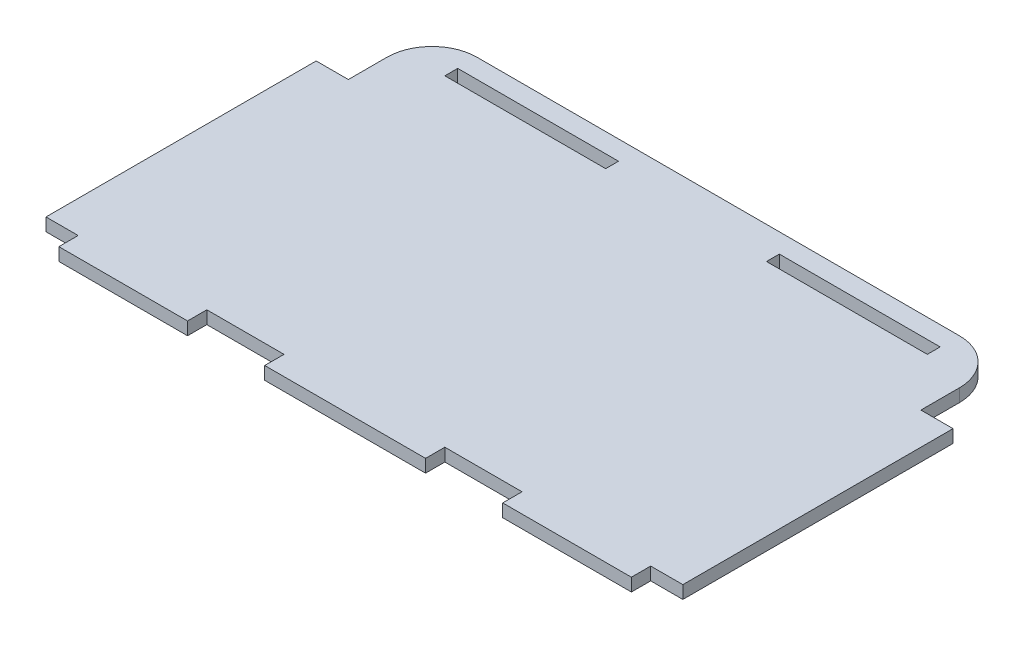
ISO-10303-21;
HEADER;
FILE_DESCRIPTION(('STEP AP214'),'2;1');
FILE_NAME('part.step','',(''),(''),'','','');
FILE_SCHEMA(('AUTOMOTIVE_DESIGN { 1 0 10303 214 1 1 1 1 }'));
ENDSEC;
DATA;
#1=APPLICATION_CONTEXT('core data for automotive mechanical design processes');
#2=APPLICATION_PROTOCOL_DEFINITION('international standard','automotive_design',2000,#1);
#3=PRODUCT_CONTEXT('',#1,'mechanical');
#4=PRODUCT('Part','Part','',(#3));
#5=PRODUCT_RELATED_PRODUCT_CATEGORY('part','',(#4));
#6=PRODUCT_DEFINITION_FORMATION('','',#4);
#7=PRODUCT_DEFINITION_CONTEXT('part definition',#1,'design');
#8=PRODUCT_DEFINITION('design','',#6,#7);
#9=PRODUCT_DEFINITION_SHAPE('','',#8);
#10=(LENGTH_UNIT() NAMED_UNIT(*) SI_UNIT(.MILLI.,.METRE.));
#11=(NAMED_UNIT(*) PLANE_ANGLE_UNIT() SI_UNIT($,.RADIAN.));
#12=(NAMED_UNIT(*) SI_UNIT($,.STERADIAN.) SOLID_ANGLE_UNIT());
#13=UNCERTAINTY_MEASURE_WITH_UNIT(LENGTH_MEASURE(1.E-05),#10,'distance_accuracy_value','');
#14=(GEOMETRIC_REPRESENTATION_CONTEXT(3) GLOBAL_UNCERTAINTY_ASSIGNED_CONTEXT((#13)) GLOBAL_UNIT_ASSIGNED_CONTEXT((#10,
#11,#12)) REPRESENTATION_CONTEXT('',''));
#15=CARTESIAN_POINT('',(0.,0.,0.));
#16=DIRECTION('',(0.,0.,1.));
#17=DIRECTION('',(1.,0.,0.));
#18=AXIS2_PLACEMENT_3D('',#15,#16,#17);
#19=CARTESIAN_POINT('',(-44.5,-23.5,134.022469073824));
#20=DIRECTION('',(1.,0.,0.));
#21=DIRECTION('',(0.,0.,-1.));
#22=AXIS2_PLACEMENT_3D('',#19,#20,#21);
#23=PLANE('',#22);
#24=DIRECTION('',(0.,0.,-1.));
#25=VECTOR('',#24,1.);
#26=CARTESIAN_POINT('',(-44.5,-21.5,134.022469073824));
#27=LINE('',#26,#25);
#28=CARTESIAN_POINT('',(-44.4999999999999,-21.5,0.));
#29=VERTEX_POINT('',#28);
#30=CARTESIAN_POINT('',(-44.5,-21.5,-6.00000000000001));
#31=VERTEX_POINT('',#30);
#32=EDGE_CURVE('E369',#29,#31,#27,.T.);
#33=ORIENTED_EDGE('',*,*,#32,.T.);
#34=DIRECTION('',(0.,1.,0.));
#35=VECTOR('',#34,1.);
#36=CARTESIAN_POINT('',(-44.5,-23.5,-6.00000000000001));
#37=LINE('',#36,#35);
#38=CARTESIAN_POINT('',(-44.5,-23.5,-6.00000000000001));
#39=VERTEX_POINT('',#38);
#40=EDGE_CURVE('E56',#31,#39,#37,.F.);
#41=ORIENTED_EDGE('',*,*,#40,.T.);
#42=DIRECTION('',(0.,0.,-1.));
#43=VECTOR('',#42,1.);
#44=CARTESIAN_POINT('',(-44.5,-23.5,134.022469073824));
#45=LINE('',#44,#43);
#46=CARTESIAN_POINT('',(-44.4999999999999,-23.5,0.));
#47=VERTEX_POINT('',#46);
#48=EDGE_CURVE('E359',#47,#39,#45,.T.);
#49=ORIENTED_EDGE('',*,*,#48,.F.);
#50=DIRECTION('',(0.,1.,0.));
#51=VECTOR('',#50,1.);
#52=CARTESIAN_POINT('',(-44.4999999999999,-21.5,0.));
#53=LINE('',#52,#51);
#54=EDGE_CURVE('E293',#47,#29,#53,.T.);
#55=ORIENTED_EDGE('',*,*,#54,.T.);
#56=EDGE_LOOP('',(#33,#41,#49,#55));
#57=FACE_BOUND('',#56,.T.);
#58=ADVANCED_FACE('F33',(#57),#23,.F.);
#59=CARTESIAN_POINT('',(44.5,-23.5,134.022469073824));
#60=DIRECTION('',(-1.,0.,0.));
#61=DIRECTION('',(0.,-1.,0.));
#62=AXIS2_PLACEMENT_3D('',#59,#60,#61);
#63=PLANE('',#62);
#64=DIRECTION('',(0.,0.,-1.));
#65=VECTOR('',#64,1.);
#66=CARTESIAN_POINT('',(44.5,-23.5,134.022469073824));
#67=LINE('',#66,#65);
#68=CARTESIAN_POINT('',(44.5,-23.5,0.));
#69=VERTEX_POINT('',#68);
#70=CARTESIAN_POINT('',(44.5,-23.5,-6.00000000000001));
#71=VERTEX_POINT('',#70);
#72=EDGE_CURVE('E401',#69,#71,#67,.T.);
#73=ORIENTED_EDGE('',*,*,#72,.T.);
#74=DIRECTION('',(0.,-1.,0.));
#75=VECTOR('',#74,1.);
#76=CARTESIAN_POINT('',(44.5,-23.5,-6.00000000000001));
#77=LINE('',#76,#75);
#78=CARTESIAN_POINT('',(44.5,-21.5,-6.00000000000001));
#79=VERTEX_POINT('',#78);
#80=EDGE_CURVE('E11',#71,#79,#77,.F.);
#81=ORIENTED_EDGE('',*,*,#80,.T.);
#82=DIRECTION('',(0.,0.,-1.));
#83=VECTOR('',#82,1.);
#84=CARTESIAN_POINT('',(44.5,-21.5,134.022469073824));
#85=LINE('',#84,#83);
#86=CARTESIAN_POINT('',(44.5,-21.5,0.));
#87=VERTEX_POINT('',#86);
#88=EDGE_CURVE('E375',#87,#79,#85,.T.);
#89=ORIENTED_EDGE('',*,*,#88,.F.);
#90=DIRECTION('',(0.,1.,0.));
#91=VECTOR('',#90,1.);
#92=CARTESIAN_POINT('',(44.4999999999999,-21.5,0.));
#93=LINE('',#92,#91);
#94=EDGE_CURVE('E320',#69,#87,#93,.T.);
#95=ORIENTED_EDGE('',*,*,#94,.F.);
#96=EDGE_LOOP('',(#73,#81,#89,#95));
#97=FACE_BOUND('',#96,.T.);
#98=ADVANCED_FACE('F550',(#97),#63,.F.);
#99=DIRECTION('',(0.,-1.,0.));
#100=VECTOR('',#99,1.);
#101=CARTESIAN_POINT('',(44.4999999999999,-21.5,42.));
#102=LINE('',#101,#100);
#103=CARTESIAN_POINT('',(44.5,-21.5,42.));
#104=VERTEX_POINT('',#103);
#105=CARTESIAN_POINT('',(44.4999999999999,-23.5,42.));
#106=VERTEX_POINT('',#105);
#107=EDGE_CURVE('E440',#104,#106,#102,.T.);
#108=ORIENTED_EDGE('',*,*,#107,.F.);
#109=CARTESIAN_POINT('',(44.5,-21.5,45.));
#110=VERTEX_POINT('',#109);
#111=EDGE_CURVE('E398',#110,#104,#85,.T.);
#112=ORIENTED_EDGE('',*,*,#111,.F.);
#113=DIRECTION('',(0.,-1.,0.));
#114=VECTOR('',#113,1.);
#115=CARTESIAN_POINT('',(44.5,-23.5,45.));
#116=LINE('',#115,#114);
#117=CARTESIAN_POINT('',(44.5,-23.5,45.));
#118=VERTEX_POINT('',#117);
#119=EDGE_CURVE('E421',#110,#118,#116,.T.);
#120=ORIENTED_EDGE('',*,*,#119,.T.);
#121=EDGE_CURVE('E750',#118,#106,#67,.T.);
#122=ORIENTED_EDGE('',*,*,#121,.T.);
#123=EDGE_LOOP('',(#108,#112,#120,#122));
#124=FACE_BOUND('',#123,.T.);
#125=ADVANCED_FACE('F555',(#124),#63,.F.);
#126=CARTESIAN_POINT('',(0.,-35.5,45.));
#127=DIRECTION('',(0.,0.,-1.));
#128=DIRECTION('',(-1.,0.,0.));
#129=AXIS2_PLACEMENT_3D('',#126,#127,#128);
#130=PLANE('',#129);
#131=DIRECTION('',(1.,0.,0.));
#132=VECTOR('',#131,1.);
#133=CARTESIAN_POINT('',(-44.5,-21.5,45.));
#134=LINE('',#133,#132);
#135=CARTESIAN_POINT('',(-12.5,-21.5,45.));
#136=VERTEX_POINT('',#135);
#137=CARTESIAN_POINT('',(12.5,-21.5,45.));
#138=VERTEX_POINT('',#137);
#139=EDGE_CURVE('E422',#136,#138,#134,.T.);
#140=ORIENTED_EDGE('',*,*,#139,.F.);
#141=DIRECTION('',(0.,-1.,0.));
#142=VECTOR('',#141,1.);
#143=CARTESIAN_POINT('',(-12.5,-35.5,45.));
#144=LINE('',#143,#142);
#145=CARTESIAN_POINT('',(-12.5,-23.5,45.));
#146=VERTEX_POINT('',#145);
#147=EDGE_CURVE('E404',#136,#146,#144,.T.);
#148=ORIENTED_EDGE('',*,*,#147,.T.);
#149=DIRECTION('',(-1.,0.,0.));
#150=VECTOR('',#149,1.);
#151=CARTESIAN_POINT('',(-44.5,-23.5,45.));
#152=LINE('',#151,#150);
#153=CARTESIAN_POINT('',(12.5,-23.5,45.));
#154=VERTEX_POINT('',#153);
#155=EDGE_CURVE('E510',#154,#146,#152,.T.);
#156=ORIENTED_EDGE('',*,*,#155,.F.);
#157=DIRECTION('',(0.,1.,0.));
#158=VECTOR('',#157,1.);
#159=CARTESIAN_POINT('',(12.5,-35.5,45.));
#160=LINE('',#159,#158);
#161=EDGE_CURVE('E416',#154,#138,#160,.T.);
#162=ORIENTED_EDGE('',*,*,#161,.T.);
#163=EDGE_LOOP('',(#140,#148,#156,#162));
#164=FACE_BOUND('',#163,.T.);
#165=ADVANCED_FACE('F566',(#164),#130,.F.);
#166=CARTESIAN_POINT('',(24.5,-21.5,45.));
#167=VERTEX_POINT('',#166);
#168=EDGE_CURVE('E423',#167,#110,#134,.T.);
#169=ORIENTED_EDGE('',*,*,#168,.F.);
#170=DIRECTION('',(0.,-1.,0.));
#171=VECTOR('',#170,1.);
#172=CARTESIAN_POINT('',(24.5,-35.5,45.));
#173=LINE('',#172,#171);
#174=CARTESIAN_POINT('',(24.5,-23.5,45.));
#175=VERTEX_POINT('',#174);
#176=EDGE_CURVE('E413',#167,#175,#173,.T.);
#177=ORIENTED_EDGE('',*,*,#176,.T.);
#178=EDGE_CURVE('E508',#118,#175,#152,.T.);
#179=ORIENTED_EDGE('',*,*,#178,.F.);
#180=ORIENTED_EDGE('',*,*,#119,.F.);
#181=EDGE_LOOP('',(#169,#177,#179,#180));
#182=FACE_BOUND('',#181,.T.);
#183=ADVANCED_FACE('F567',(#182),#130,.F.);
#184=CARTESIAN_POINT('',(-44.5,-21.5,134.022469073824));
#185=DIRECTION('',(0.,-1.,0.));
#186=DIRECTION('',(0.,0.,-1.));
#187=AXIS2_PLACEMENT_3D('',#184,#185,#186);
#188=PLANE('',#187);
#189=DIRECTION('',(1.,0.,0.));
#190=VECTOR('',#189,1.);
#191=CARTESIAN_POINT('',(12.5,-21.5,-8.00000000000001));
#192=LINE('',#191,#190);
#193=CARTESIAN_POINT('',(12.5,-21.5,-8.00000000000001));
#194=VERTEX_POINT('',#193);
#195=CARTESIAN_POINT('',(37.5,-21.5,-8.00000000000001));
#196=VERTEX_POINT('',#195);
#197=EDGE_CURVE('E248',#194,#196,#192,.T.);
#198=ORIENTED_EDGE('',*,*,#197,.F.);
#199=DIRECTION('',(0.,0.,1.));
#200=VECTOR('',#199,1.);
#201=CARTESIAN_POINT('',(12.5,-21.5,-10.));
#202=LINE('',#201,#200);
#203=CARTESIAN_POINT('',(12.5,-21.5,-10.));
#204=VERTEX_POINT('',#203);
#205=EDGE_CURVE('E253',#204,#194,#202,.T.);
#206=ORIENTED_EDGE('',*,*,#205,.F.);
#207=DIRECTION('',(-1.,0.,0.));
#208=VECTOR('',#207,1.);
#209=CARTESIAN_POINT('',(12.5,-21.5,-10.));
#210=LINE('',#209,#208);
#211=CARTESIAN_POINT('',(37.5,-21.5,-10.));
#212=VERTEX_POINT('',#211);
#213=EDGE_CURVE('E258',#212,#204,#210,.T.);
#214=ORIENTED_EDGE('',*,*,#213,.F.);
#215=DIRECTION('',(0.,0.,-1.));
#216=VECTOR('',#215,1.);
#217=CARTESIAN_POINT('',(37.5,-21.5,-10.));
#218=LINE('',#217,#216);
#219=EDGE_CURVE('E237',#196,#212,#218,.T.);
#220=ORIENTED_EDGE('',*,*,#219,.F.);
#221=EDGE_LOOP('',(#198,#206,#214,#220));
#222=FACE_BOUND('',#221,.T.);
#223=DIRECTION('',(1.,0.,0.));
#224=VECTOR('',#223,1.);
#225=CARTESIAN_POINT('',(-37.5,-21.5,-8.00000000000001));
#226=LINE('',#225,#224);
#227=CARTESIAN_POINT('',(-37.5,-21.5,-8.00000000000001));
#228=VERTEX_POINT('',#227);
#229=CARTESIAN_POINT('',(-12.5,-21.5,-8.00000000000001));
#230=VERTEX_POINT('',#229);
#231=EDGE_CURVE('E269',#228,#230,#226,.T.);
#232=ORIENTED_EDGE('',*,*,#231,.F.);
#233=DIRECTION('',(0.,0.,1.));
#234=VECTOR('',#233,1.);
#235=CARTESIAN_POINT('',(-37.5,-21.5,-10.));
#236=LINE('',#235,#234);
#237=CARTESIAN_POINT('',(-37.5,-21.5,-10.));
#238=VERTEX_POINT('',#237);
#239=EDGE_CURVE('E265',#238,#228,#236,.T.);
#240=ORIENTED_EDGE('',*,*,#239,.F.);
#241=DIRECTION('',(-1.,0.,0.));
#242=VECTOR('',#241,1.);
#243=CARTESIAN_POINT('',(-37.5,-21.5,-10.));
#244=LINE('',#243,#242);
#245=CARTESIAN_POINT('',(-12.5,-21.5,-10.));
#246=VERTEX_POINT('',#245);
#247=EDGE_CURVE('E275',#246,#238,#244,.T.);
#248=ORIENTED_EDGE('',*,*,#247,.F.);
#249=DIRECTION('',(0.,0.,-1.));
#250=VECTOR('',#249,1.);
#251=CARTESIAN_POINT('',(-12.5,-21.5,-10.));
#252=LINE('',#251,#250);
#253=EDGE_CURVE('E272',#230,#246,#252,.T.);
#254=ORIENTED_EDGE('',*,*,#253,.F.);
#255=EDGE_LOOP('',(#232,#240,#248,#254));
#256=FACE_BOUND('',#255,.T.);
#257=DIRECTION('',(1.,0.,0.));
#258=VECTOR('',#257,1.);
#259=CARTESIAN_POINT('',(-44.5,-21.5,-13.));
#260=LINE('',#259,#258);
#261=CARTESIAN_POINT('',(-37.5,-21.5,-13.));
#262=VERTEX_POINT('',#261);
#263=CARTESIAN_POINT('',(37.5,-21.5,-13.));
#264=VERTEX_POINT('',#263);
#265=EDGE_CURVE('E281',#262,#264,#260,.T.);
#266=ORIENTED_EDGE('',*,*,#265,.F.);
#267=CARTESIAN_POINT('',(-37.5,-21.5,-6.));
#268=DIRECTION('',(0.,-1.,0.));
#269=DIRECTION('',(0.,0.,-1.));
#270=AXIS2_PLACEMENT_3D('',#267,#268,#269);
#271=CIRCLE('',#270,7.);
#272=EDGE_CURVE('E354',#262,#31,#271,.F.);
#273=ORIENTED_EDGE('',*,*,#272,.T.);
#274=ORIENTED_EDGE('',*,*,#32,.F.);
#275=DIRECTION('',(1.,0.,0.));
#276=VECTOR('',#275,1.);
#277=CARTESIAN_POINT('',(-49.4999999999999,-21.5,0.));
#278=LINE('',#277,#276);
#279=CARTESIAN_POINT('',(-49.4999999999999,-21.5,0.));
#280=VERTEX_POINT('',#279);
#281=EDGE_CURVE('E307',#280,#29,#278,.T.);
#282=ORIENTED_EDGE('',*,*,#281,.F.);
#283=DIRECTION('',(0.,0.,1.));
#284=VECTOR('',#283,1.);
#285=CARTESIAN_POINT('',(-49.4999999999999,-21.5,0.));
#286=LINE('',#285,#284);
#287=CARTESIAN_POINT('',(-49.4999999999999,-21.5,42.));
#288=VERTEX_POINT('',#287);
#289=EDGE_CURVE('E304',#280,#288,#286,.T.);
#290=ORIENTED_EDGE('',*,*,#289,.T.);
#291=DIRECTION('',(1.,0.,0.));
#292=VECTOR('',#291,1.);
#293=CARTESIAN_POINT('',(-49.4999999999999,-21.5,42.));
#294=LINE('',#293,#292);
#295=CARTESIAN_POINT('',(-44.4999999999999,-21.5,42.));
#296=VERTEX_POINT('',#295);
#297=EDGE_CURVE('E526',#288,#296,#294,.T.);
#298=ORIENTED_EDGE('',*,*,#297,.T.);
#299=CARTESIAN_POINT('',(-44.5,-21.5,45.));
#300=VERTEX_POINT('',#299);
#301=EDGE_CURVE('E371',#300,#296,#27,.T.);
#302=ORIENTED_EDGE('',*,*,#301,.F.);
#303=CARTESIAN_POINT('',(-24.5,-21.5,45.));
#304=VERTEX_POINT('',#303);
#305=EDGE_CURVE('E419',#300,#304,#134,.T.);
#306=ORIENTED_EDGE('',*,*,#305,.T.);
#307=DIRECTION('',(0.,0.,1.));
#308=VECTOR('',#307,1.);
#309=CARTESIAN_POINT('',(-24.5,-21.5,45.));
#310=LINE('',#309,#308);
#311=CARTESIAN_POINT('',(-24.5,-21.5,42.));
#312=VERTEX_POINT('',#311);
#313=EDGE_CURVE('E475',#312,#304,#310,.T.);
#314=ORIENTED_EDGE('',*,*,#313,.F.);
#315=DIRECTION('',(-1.,0.,0.));
#316=VECTOR('',#315,1.);
#317=CARTESIAN_POINT('',(-12.5,-21.5,42.));
#318=LINE('',#317,#316);
#319=CARTESIAN_POINT('',(-12.5,-21.5,42.));
#320=VERTEX_POINT('',#319);
#321=EDGE_CURVE('E469',#320,#312,#318,.T.);
#322=ORIENTED_EDGE('',*,*,#321,.F.);
#323=DIRECTION('',(0.,0.,-1.));
#324=VECTOR('',#323,1.);
#325=CARTESIAN_POINT('',(-12.5,-21.5,45.));
#326=LINE('',#325,#324);
#327=EDGE_CURVE('E449',#136,#320,#326,.T.);
#328=ORIENTED_EDGE('',*,*,#327,.F.);
#329=ORIENTED_EDGE('',*,*,#139,.T.);
#330=DIRECTION('',(0.,0.,1.));
#331=VECTOR('',#330,1.);
#332=CARTESIAN_POINT('',(12.5,-21.5,45.));
#333=LINE('',#332,#331);
#334=CARTESIAN_POINT('',(12.5,-21.5,42.));
#335=VERTEX_POINT('',#334);
#336=EDGE_CURVE('E497',#335,#138,#333,.T.);
#337=ORIENTED_EDGE('',*,*,#336,.F.);
#338=DIRECTION('',(-1.,0.,0.));
#339=VECTOR('',#338,1.);
#340=CARTESIAN_POINT('',(24.5,-21.5,42.));
#341=LINE('',#340,#339);
#342=CARTESIAN_POINT('',(24.5,-21.5,42.));
#343=VERTEX_POINT('',#342);
#344=EDGE_CURVE('E494',#343,#335,#341,.T.);
#345=ORIENTED_EDGE('',*,*,#344,.F.);
#346=DIRECTION('',(0.,0.,-1.));
#347=VECTOR('',#346,1.);
#348=CARTESIAN_POINT('',(24.5,-21.5,45.));
#349=LINE('',#348,#347);
#350=EDGE_CURVE('E491',#167,#343,#349,.T.);
#351=ORIENTED_EDGE('',*,*,#350,.F.);
#352=ORIENTED_EDGE('',*,*,#168,.T.);
#353=ORIENTED_EDGE('',*,*,#111,.T.);
#354=DIRECTION('',(-1.,0.,0.));
#355=VECTOR('',#354,1.);
#356=CARTESIAN_POINT('',(49.4999999999999,-21.5,42.));
#357=LINE('',#356,#355);
#358=CARTESIAN_POINT('',(49.4999999999999,-21.5,42.));
#359=VERTEX_POINT('',#358);
#360=EDGE_CURVE('E458',#359,#104,#357,.T.);
#361=ORIENTED_EDGE('',*,*,#360,.F.);
#362=DIRECTION('',(0.,0.,1.));
#363=VECTOR('',#362,1.);
#364=CARTESIAN_POINT('',(49.4999999999999,-21.5,0.));
#365=LINE('',#364,#363);
#366=CARTESIAN_POINT('',(49.4999999999999,-21.5,0.));
#367=VERTEX_POINT('',#366);
#368=EDGE_CURVE('E761',#367,#359,#365,.T.);
#369=ORIENTED_EDGE('',*,*,#368,.F.);
#370=DIRECTION('',(-1.,0.,0.));
#371=VECTOR('',#370,1.);
#372=CARTESIAN_POINT('',(49.4999999999999,-21.5,0.));
#373=LINE('',#372,#371);
#374=EDGE_CURVE('E463',#367,#87,#373,.T.);
#375=ORIENTED_EDGE('',*,*,#374,.T.);
#376=ORIENTED_EDGE('',*,*,#88,.T.);
#377=CARTESIAN_POINT('',(37.5,-21.5,-6.));
#378=DIRECTION('',(0.,-1.,0.));
#379=DIRECTION('',(0.,0.,-1.));
#380=AXIS2_PLACEMENT_3D('',#377,#378,#379);
#381=CIRCLE('',#380,7.);
#382=EDGE_CURVE('E352',#79,#264,#381,.F.);
#383=ORIENTED_EDGE('',*,*,#382,.T.);
#384=EDGE_LOOP('',(#266,#273,#274,#282,#290,#298,#302,#306,#314,#322,#328,#329,#337,#345,#351,
#352,#353,#361,#369,#375,#376,#383));
#385=FACE_BOUND('',#384,.T.);
#386=ADVANCED_FACE('F255',(#222,#256,#385),#188,.F.);
#387=CARTESIAN_POINT('',(-44.5,-23.5,134.022469073824));
#388=DIRECTION('',(0.,1.,0.));
#389=DIRECTION('',(0.,0.,1.));
#390=AXIS2_PLACEMENT_3D('',#387,#388,#389);
#391=PLANE('',#390);
#392=DIRECTION('',(-1.,0.,0.));
#393=VECTOR('',#392,1.);
#394=CARTESIAN_POINT('',(-44.5,-23.5,-10.));
#395=LINE('',#394,#393);
#396=CARTESIAN_POINT('',(37.5,-23.5,-10.));
#397=VERTEX_POINT('',#396);
#398=CARTESIAN_POINT('',(12.5,-23.5,-10.));
#399=VERTEX_POINT('',#398);
#400=EDGE_CURVE('E340',#397,#399,#395,.T.);
#401=ORIENTED_EDGE('',*,*,#400,.T.);
#402=DIRECTION('',(0.,0.,1.));
#403=VECTOR('',#402,1.);
#404=CARTESIAN_POINT('',(12.5,-23.5,134.022469073824));
#405=LINE('',#404,#403);
#406=CARTESIAN_POINT('',(12.5,-23.5,-8.00000000000001));
#407=VERTEX_POINT('',#406);
#408=EDGE_CURVE('E343',#399,#407,#405,.T.);
#409=ORIENTED_EDGE('',*,*,#408,.T.);
#410=DIRECTION('',(1.,0.,0.));
#411=VECTOR('',#410,1.);
#412=CARTESIAN_POINT('',(-44.5,-23.5,-8.00000000000001));
#413=LINE('',#412,#411);
#414=CARTESIAN_POINT('',(37.5,-23.5,-8.00000000000001));
#415=VERTEX_POINT('',#414);
#416=EDGE_CURVE('E337',#407,#415,#413,.T.);
#417=ORIENTED_EDGE('',*,*,#416,.T.);
#418=DIRECTION('',(0.,0.,-1.));
#419=VECTOR('',#418,1.);
#420=CARTESIAN_POINT('',(37.5,-23.5,134.022469073824));
#421=LINE('',#420,#419);
#422=EDGE_CURVE('E240',#415,#397,#421,.T.);
#423=ORIENTED_EDGE('',*,*,#422,.T.);
#424=EDGE_LOOP('',(#401,#409,#417,#423));
#425=FACE_BOUND('',#424,.T.);
#426=DIRECTION('',(-1.,0.,0.));
#427=VECTOR('',#426,1.);
#428=CARTESIAN_POINT('',(-44.5,-23.5,-10.));
#429=LINE('',#428,#427);
#430=CARTESIAN_POINT('',(-12.5,-23.5,-10.));
#431=VERTEX_POINT('',#430);
#432=CARTESIAN_POINT('',(-37.5,-23.5,-10.));
#433=VERTEX_POINT('',#432);
#434=EDGE_CURVE('E331',#431,#433,#429,.T.);
#435=ORIENTED_EDGE('',*,*,#434,.T.);
#436=DIRECTION('',(0.,0.,1.));
#437=VECTOR('',#436,1.);
#438=CARTESIAN_POINT('',(-37.5,-23.5,134.022469073824));
#439=LINE('',#438,#437);
#440=CARTESIAN_POINT('',(-37.5,-23.5,-8.00000000000001));
#441=VERTEX_POINT('',#440);
#442=EDGE_CURVE('E334',#433,#441,#439,.T.);
#443=ORIENTED_EDGE('',*,*,#442,.T.);
#444=DIRECTION('',(1.,0.,0.));
#445=VECTOR('',#444,1.);
#446=CARTESIAN_POINT('',(-44.5,-23.5,-8.00000000000001));
#447=LINE('',#446,#445);
#448=CARTESIAN_POINT('',(-12.5,-23.5,-8.00000000000001));
#449=VERTEX_POINT('',#448);
#450=EDGE_CURVE('E324',#441,#449,#447,.T.);
#451=ORIENTED_EDGE('',*,*,#450,.T.);
#452=DIRECTION('',(0.,0.,-1.));
#453=VECTOR('',#452,1.);
#454=CARTESIAN_POINT('',(-12.5,-23.5,134.022469073824));
#455=LINE('',#454,#453);
#456=EDGE_CURVE('E327',#449,#431,#455,.T.);
#457=ORIENTED_EDGE('',*,*,#456,.T.);
#458=EDGE_LOOP('',(#435,#443,#451,#457));
#459=FACE_BOUND('',#458,.T.);
#460=ORIENTED_EDGE('',*,*,#48,.T.);
#461=CARTESIAN_POINT('',(-37.5,-23.5,-6.));
#462=DIRECTION('',(0.,1.,0.));
#463=DIRECTION('',(0.,0.,1.));
#464=AXIS2_PLACEMENT_3D('',#461,#462,#463);
#465=CIRCLE('',#464,7.);
#466=CARTESIAN_POINT('',(-37.5,-23.5,-13.));
#467=VERTEX_POINT('',#466);
#468=EDGE_CURVE('E41',#39,#467,#465,.F.);
#469=ORIENTED_EDGE('',*,*,#468,.T.);
#470=DIRECTION('',(-1.,0.,0.));
#471=VECTOR('',#470,1.);
#472=CARTESIAN_POINT('',(-44.5,-23.5,-13.));
#473=LINE('',#472,#471);
#474=CARTESIAN_POINT('',(37.5,-23.5,-13.));
#475=VERTEX_POINT('',#474);
#476=EDGE_CURVE('E290',#475,#467,#473,.T.);
#477=ORIENTED_EDGE('',*,*,#476,.F.);
#478=CARTESIAN_POINT('',(37.5,-23.5,-6.));
#479=DIRECTION('',(0.,1.,0.));
#480=DIRECTION('',(0.,0.,1.));
#481=AXIS2_PLACEMENT_3D('',#478,#479,#480);
#482=CIRCLE('',#481,7.);
#483=EDGE_CURVE('E48',#475,#71,#482,.F.);
#484=ORIENTED_EDGE('',*,*,#483,.T.);
#485=ORIENTED_EDGE('',*,*,#72,.F.);
#486=DIRECTION('',(-1.,0.,0.));
#487=VECTOR('',#486,1.);
#488=CARTESIAN_POINT('',(49.4999999999999,-23.5,0.));
#489=LINE('',#488,#487);
#490=CARTESIAN_POINT('',(49.4999999999999,-23.5,0.));
#491=VERTEX_POINT('',#490);
#492=EDGE_CURVE('E432',#491,#69,#489,.T.);
#493=ORIENTED_EDGE('',*,*,#492,.F.);
#494=DIRECTION('',(0.,0.,-1.));
#495=VECTOR('',#494,1.);
#496=CARTESIAN_POINT('',(49.4999999999999,-23.5,0.));
#497=LINE('',#496,#495);
#498=CARTESIAN_POINT('',(49.4999999999999,-23.5,42.));
#499=VERTEX_POINT('',#498);
#500=EDGE_CURVE('E436',#499,#491,#497,.T.);
#501=ORIENTED_EDGE('',*,*,#500,.F.);
#502=DIRECTION('',(-1.,0.,0.));
#503=VECTOR('',#502,1.);
#504=CARTESIAN_POINT('',(49.4999999999999,-23.5,42.));
#505=LINE('',#504,#503);
#506=EDGE_CURVE('E435',#499,#106,#505,.T.);
#507=ORIENTED_EDGE('',*,*,#506,.T.);
#508=ORIENTED_EDGE('',*,*,#121,.F.);
#509=ORIENTED_EDGE('',*,*,#178,.T.);
#510=DIRECTION('',(0.,0.,-1.));
#511=VECTOR('',#510,1.);
#512=CARTESIAN_POINT('',(24.4999999999999,-23.5,134.022469073824));
#513=LINE('',#512,#511);
#514=CARTESIAN_POINT('',(24.5,-23.5,42.));
#515=VERTEX_POINT('',#514);
#516=EDGE_CURVE('E372',#175,#515,#513,.T.);
#517=ORIENTED_EDGE('',*,*,#516,.T.);
#518=DIRECTION('',(-1.,0.,0.));
#519=VECTOR('',#518,1.);
#520=CARTESIAN_POINT('',(-44.5,-23.5,42.));
#521=LINE('',#520,#519);
#522=CARTESIAN_POINT('',(12.5,-23.5,42.));
#523=VERTEX_POINT('',#522);
#524=EDGE_CURVE('E410',#515,#523,#521,.T.);
#525=ORIENTED_EDGE('',*,*,#524,.T.);
#526=DIRECTION('',(0.,0.,1.));
#527=VECTOR('',#526,1.);
#528=CARTESIAN_POINT('',(12.5,-23.5,134.022469073824));
#529=LINE('',#528,#527);
#530=EDGE_CURVE('E378',#523,#154,#529,.T.);
#531=ORIENTED_EDGE('',*,*,#530,.T.);
#532=ORIENTED_EDGE('',*,*,#155,.T.);
#533=DIRECTION('',(0.,0.,-1.));
#534=VECTOR('',#533,1.);
#535=CARTESIAN_POINT('',(-12.5,-23.5,134.022469073824));
#536=LINE('',#535,#534);
#537=CARTESIAN_POINT('',(-12.5,-23.5,42.));
#538=VERTEX_POINT('',#537);
#539=EDGE_CURVE('E488',#146,#538,#536,.T.);
#540=ORIENTED_EDGE('',*,*,#539,.T.);
#541=DIRECTION('',(-1.,0.,0.));
#542=VECTOR('',#541,1.);
#543=CARTESIAN_POINT('',(-44.5,-23.5,42.));
#544=LINE('',#543,#542);
#545=CARTESIAN_POINT('',(-24.5,-23.5,42.));
#546=VERTEX_POINT('',#545);
#547=EDGE_CURVE('E328',#538,#546,#544,.T.);
#548=ORIENTED_EDGE('',*,*,#547,.T.);
#549=DIRECTION('',(0.,0.,1.));
#550=VECTOR('',#549,1.);
#551=CARTESIAN_POINT('',(-24.5,-23.5,134.022469073824));
#552=LINE('',#551,#550);
#553=CARTESIAN_POINT('',(-24.5,-23.5,45.));
#554=VERTEX_POINT('',#553);
#555=EDGE_CURVE('E484',#546,#554,#552,.T.);
#556=ORIENTED_EDGE('',*,*,#555,.T.);
#557=CARTESIAN_POINT('',(-44.5,-23.5,45.));
#558=VERTEX_POINT('',#557);
#559=EDGE_CURVE('E507',#554,#558,#152,.T.);
#560=ORIENTED_EDGE('',*,*,#559,.T.);
#561=CARTESIAN_POINT('',(-44.5,-23.5,42.));
#562=VERTEX_POINT('',#561);
#563=EDGE_CURVE('E427',#558,#562,#45,.T.);
#564=ORIENTED_EDGE('',*,*,#563,.T.);
#565=DIRECTION('',(1.,0.,0.));
#566=VECTOR('',#565,1.);
#567=CARTESIAN_POINT('',(-49.4999999999999,-23.5,42.));
#568=LINE('',#567,#566);
#569=CARTESIAN_POINT('',(-49.4999999999999,-23.5,42.));
#570=VERTEX_POINT('',#569);
#571=EDGE_CURVE('E321',#570,#562,#568,.T.);
#572=ORIENTED_EDGE('',*,*,#571,.F.);
#573=DIRECTION('',(0.,0.,-1.));
#574=VECTOR('',#573,1.);
#575=CARTESIAN_POINT('',(-49.4999999999999,-23.5,0.));
#576=LINE('',#575,#574);
#577=CARTESIAN_POINT('',(-49.4999999999999,-23.5,0.));
#578=VERTEX_POINT('',#577);
#579=EDGE_CURVE('E297',#570,#578,#576,.T.);
#580=ORIENTED_EDGE('',*,*,#579,.T.);
#581=DIRECTION('',(1.,0.,0.));
#582=VECTOR('',#581,1.);
#583=CARTESIAN_POINT('',(-49.4999999999999,-23.5,0.));
#584=LINE('',#583,#582);
#585=EDGE_CURVE('E318',#578,#47,#584,.T.);
#586=ORIENTED_EDGE('',*,*,#585,.T.);
#587=EDGE_LOOP('',(#460,#469,#477,#484,#485,#493,#501,#507,#508,#509,#517,#525,#531,#532,#540,
#548,#556,#560,#564,#572,#580,#586));
#588=FACE_BOUND('',#587,.T.);
#589=ADVANCED_FACE('F358',(#425,#459,#588),#391,.F.);
#590=ORIENTED_EDGE('',*,*,#301,.T.);
#591=DIRECTION('',(0.,-1.,0.));
#592=VECTOR('',#591,1.);
#593=CARTESIAN_POINT('',(-44.4999999999999,-21.5,42.));
#594=LINE('',#593,#592);
#595=EDGE_CURVE('E298',#296,#562,#594,.T.);
#596=ORIENTED_EDGE('',*,*,#595,.T.);
#597=ORIENTED_EDGE('',*,*,#563,.F.);
#598=DIRECTION('',(0.,1.,0.));
#599=VECTOR('',#598,1.);
#600=CARTESIAN_POINT('',(-44.5,-23.5,45.));
#601=LINE('',#600,#599);
#602=EDGE_CURVE('E387',#558,#300,#601,.T.);
#603=ORIENTED_EDGE('',*,*,#602,.T.);
#604=EDGE_LOOP('',(#590,#596,#597,#603));
#605=FACE_BOUND('',#604,.T.);
#606=ADVANCED_FACE('F522',(#605),#23,.F.);
#607=ORIENTED_EDGE('',*,*,#559,.F.);
#608=DIRECTION('',(0.,1.,0.));
#609=VECTOR('',#608,1.);
#610=CARTESIAN_POINT('',(-24.5,-35.5,45.));
#611=LINE('',#610,#609);
#612=EDGE_CURVE('E407',#554,#304,#611,.T.);
#613=ORIENTED_EDGE('',*,*,#612,.T.);
#614=ORIENTED_EDGE('',*,*,#305,.F.);
#615=ORIENTED_EDGE('',*,*,#602,.F.);
#616=EDGE_LOOP('',(#607,#613,#614,#615));
#617=FACE_BOUND('',#616,.T.);
#618=ADVANCED_FACE('F518',(#617),#130,.F.);
#619=CARTESIAN_POINT('',(24.5,-31.5,42.));
#620=DIRECTION('',(0.,0.,-1.));
#621=DIRECTION('',(-1.,0.,0.));
#622=AXIS2_PLACEMENT_3D('',#619,#620,#621);
#623=PLANE('',#622);
#624=DIRECTION('',(0.,1.,0.));
#625=VECTOR('',#624,1.);
#626=CARTESIAN_POINT('',(24.5,-31.5,42.));
#627=LINE('',#626,#625);
#628=EDGE_CURVE('E500',#515,#343,#627,.T.);
#629=ORIENTED_EDGE('',*,*,#628,.T.);
#630=ORIENTED_EDGE('',*,*,#344,.T.);
#631=DIRECTION('',(0.,1.,0.));
#632=VECTOR('',#631,1.);
#633=CARTESIAN_POINT('',(12.5,-31.5,42.));
#634=LINE('',#633,#632);
#635=EDGE_CURVE('E501',#523,#335,#634,.T.);
#636=ORIENTED_EDGE('',*,*,#635,.F.);
#637=ORIENTED_EDGE('',*,*,#524,.F.);
#638=EDGE_LOOP('',(#629,#630,#636,#637));
#639=FACE_BOUND('',#638,.T.);
#640=ADVANCED_FACE('F564',(#639),#623,.F.);
#641=CARTESIAN_POINT('',(24.5,-31.5,45.));
#642=DIRECTION('',(1.,0.,0.));
#643=DIRECTION('',(0.,0.,-1.));
#644=AXIS2_PLACEMENT_3D('',#641,#642,#643);
#645=PLANE('',#644);
#646=ORIENTED_EDGE('',*,*,#176,.F.);
#647=ORIENTED_EDGE('',*,*,#350,.T.);
#648=ORIENTED_EDGE('',*,*,#628,.F.);
#649=ORIENTED_EDGE('',*,*,#516,.F.);
#650=EDGE_LOOP('',(#646,#647,#648,#649));
#651=FACE_BOUND('',#650,.T.);
#652=ADVANCED_FACE('F575',(#651),#645,.F.);
#653=CARTESIAN_POINT('',(12.5,-31.5,45.));
#654=DIRECTION('',(-1.,0.,0.));
#655=DIRECTION('',(0.,0.,1.));
#656=AXIS2_PLACEMENT_3D('',#653,#654,#655);
#657=PLANE('',#656);
#658=ORIENTED_EDGE('',*,*,#635,.T.);
#659=ORIENTED_EDGE('',*,*,#336,.T.);
#660=ORIENTED_EDGE('',*,*,#161,.F.);
#661=ORIENTED_EDGE('',*,*,#530,.F.);
#662=EDGE_LOOP('',(#658,#659,#660,#661));
#663=FACE_BOUND('',#662,.T.);
#664=ADVANCED_FACE('F578',(#663),#657,.F.);
#665=CARTESIAN_POINT('',(-12.5,-31.5,42.));
#666=DIRECTION('',(0.,0.,-1.));
#667=DIRECTION('',(-1.,0.,0.));
#668=AXIS2_PLACEMENT_3D('',#665,#666,#667);
#669=PLANE('',#668);
#670=DIRECTION('',(0.,1.,0.));
#671=VECTOR('',#670,1.);
#672=CARTESIAN_POINT('',(-12.5,-31.5,42.));
#673=LINE('',#672,#671);
#674=EDGE_CURVE('E479',#538,#320,#673,.T.);
#675=ORIENTED_EDGE('',*,*,#674,.T.);
#676=ORIENTED_EDGE('',*,*,#321,.T.);
#677=DIRECTION('',(0.,1.,0.));
#678=VECTOR('',#677,1.);
#679=CARTESIAN_POINT('',(-24.5,-31.5,42.));
#680=LINE('',#679,#678);
#681=EDGE_CURVE('E482',#546,#312,#680,.T.);
#682=ORIENTED_EDGE('',*,*,#681,.F.);
#683=ORIENTED_EDGE('',*,*,#547,.F.);
#684=EDGE_LOOP('',(#675,#676,#682,#683));
#685=FACE_BOUND('',#684,.T.);
#686=ADVANCED_FACE('F585',(#685),#669,.F.);
#687=CARTESIAN_POINT('',(-12.5,-31.5,45.));
#688=DIRECTION('',(1.,0.,0.));
#689=DIRECTION('',(0.,0.,-1.));
#690=AXIS2_PLACEMENT_3D('',#687,#688,#689);
#691=PLANE('',#690);
#692=ORIENTED_EDGE('',*,*,#147,.F.);
#693=ORIENTED_EDGE('',*,*,#327,.T.);
#694=ORIENTED_EDGE('',*,*,#674,.F.);
#695=ORIENTED_EDGE('',*,*,#539,.F.);
#696=EDGE_LOOP('',(#692,#693,#694,#695));
#697=FACE_BOUND('',#696,.T.);
#698=ADVANCED_FACE('F587',(#697),#691,.F.);
#699=CARTESIAN_POINT('',(-24.5,-31.5,45.));
#700=DIRECTION('',(-1.,0.,0.));
#701=DIRECTION('',(0.,0.,1.));
#702=AXIS2_PLACEMENT_3D('',#699,#700,#701);
#703=PLANE('',#702);
#704=ORIENTED_EDGE('',*,*,#681,.T.);
#705=ORIENTED_EDGE('',*,*,#313,.T.);
#706=ORIENTED_EDGE('',*,*,#612,.F.);
#707=ORIENTED_EDGE('',*,*,#555,.F.);
#708=EDGE_LOOP('',(#704,#705,#706,#707));
#709=FACE_BOUND('',#708,.T.);
#710=ADVANCED_FACE('F590',(#709),#703,.F.);
#711=CARTESIAN_POINT('',(49.4999999999999,-21.5,0.));
#712=DIRECTION('',(0.,0.,1.));
#713=DIRECTION('',(0.,-1.,0.));
#714=AXIS2_PLACEMENT_3D('',#711,#712,#713);
#715=PLANE('',#714);
#716=ORIENTED_EDGE('',*,*,#94,.T.);
#717=ORIENTED_EDGE('',*,*,#374,.F.);
#718=DIRECTION('',(0.,1.,0.));
#719=VECTOR('',#718,1.);
#720=CARTESIAN_POINT('',(49.4999999999999,-21.5,0.));
#721=LINE('',#720,#719);
#722=EDGE_CURVE('E455',#491,#367,#721,.T.);
#723=ORIENTED_EDGE('',*,*,#722,.F.);
#724=ORIENTED_EDGE('',*,*,#492,.T.);
#725=EDGE_LOOP('',(#716,#717,#723,#724));
#726=FACE_BOUND('',#725,.T.);
#727=ADVANCED_FACE('F595',(#726),#715,.F.);
#728=CARTESIAN_POINT('',(49.4999999999999,-21.5,42.));
#729=DIRECTION('',(0.,0.,-1.));
#730=DIRECTION('',(-1.,0.,0.));
#731=AXIS2_PLACEMENT_3D('',#728,#729,#730);
#732=PLANE('',#731);
#733=ORIENTED_EDGE('',*,*,#107,.T.);
#734=ORIENTED_EDGE('',*,*,#506,.F.);
#735=DIRECTION('',(0.,-1.,0.));
#736=VECTOR('',#735,1.);
#737=CARTESIAN_POINT('',(49.4999999999999,-21.5,42.));
#738=LINE('',#737,#736);
#739=EDGE_CURVE('E760',#359,#499,#738,.T.);
#740=ORIENTED_EDGE('',*,*,#739,.F.);
#741=ORIENTED_EDGE('',*,*,#360,.T.);
#742=EDGE_LOOP('',(#733,#734,#740,#741));
#743=FACE_BOUND('',#742,.T.);
#744=ADVANCED_FACE('F599',(#743),#732,.F.);
#745=CARTESIAN_POINT('',(49.4999999999999,0.,0.));
#746=DIRECTION('',(-1.,0.,0.));
#747=DIRECTION('',(0.,0.,1.));
#748=AXIS2_PLACEMENT_3D('',#745,#746,#747);
#749=PLANE('',#748);
#750=ORIENTED_EDGE('',*,*,#722,.T.);
#751=ORIENTED_EDGE('',*,*,#368,.T.);
#752=ORIENTED_EDGE('',*,*,#739,.T.);
#753=ORIENTED_EDGE('',*,*,#500,.T.);
#754=EDGE_LOOP('',(#750,#751,#752,#753));
#755=FACE_BOUND('',#754,.T.);
#756=ADVANCED_FACE('F603',(#755),#749,.F.);
#757=CARTESIAN_POINT('',(-49.4999999999999,-21.5,0.));
#758=DIRECTION('',(0.,0.,-1.));
#759=DIRECTION('',(0.,1.,0.));
#760=AXIS2_PLACEMENT_3D('',#757,#758,#759);
#761=PLANE('',#760);
#762=ORIENTED_EDGE('',*,*,#54,.F.);
#763=ORIENTED_EDGE('',*,*,#585,.F.);
#764=DIRECTION('',(0.,1.,0.));
#765=VECTOR('',#764,1.);
#766=CARTESIAN_POINT('',(-49.4999999999999,-21.5,0.));
#767=LINE('',#766,#765);
#768=EDGE_CURVE('E294',#578,#280,#767,.T.);
#769=ORIENTED_EDGE('',*,*,#768,.T.);
#770=ORIENTED_EDGE('',*,*,#281,.T.);
#771=EDGE_LOOP('',(#762,#763,#769,#770));
#772=FACE_BOUND('',#771,.T.);
#773=ADVANCED_FACE('F535',(#772),#761,.T.);
#774=CARTESIAN_POINT('',(-49.4999999999999,-21.5,42.));
#775=DIRECTION('',(0.,0.,1.));
#776=DIRECTION('',(1.,0.,0.));
#777=AXIS2_PLACEMENT_3D('',#774,#775,#776);
#778=PLANE('',#777);
#779=ORIENTED_EDGE('',*,*,#595,.F.);
#780=ORIENTED_EDGE('',*,*,#297,.F.);
#781=DIRECTION('',(0.,-1.,0.));
#782=VECTOR('',#781,1.);
#783=CARTESIAN_POINT('',(-49.4999999999999,-21.5,42.));
#784=LINE('',#783,#782);
#785=EDGE_CURVE('E301',#288,#570,#784,.T.);
#786=ORIENTED_EDGE('',*,*,#785,.T.);
#787=ORIENTED_EDGE('',*,*,#571,.T.);
#788=EDGE_LOOP('',(#779,#780,#786,#787));
#789=FACE_BOUND('',#788,.T.);
#790=ADVANCED_FACE('F525',(#789),#778,.T.);
#791=CARTESIAN_POINT('',(-49.4999999999999,0.,0.));
#792=DIRECTION('',(1.,0.,0.));
#793=DIRECTION('',(0.,0.,1.));
#794=AXIS2_PLACEMENT_3D('',#791,#792,#793);
#795=PLANE('',#794);
#796=ORIENTED_EDGE('',*,*,#768,.F.);
#797=ORIENTED_EDGE('',*,*,#579,.F.);
#798=ORIENTED_EDGE('',*,*,#785,.F.);
#799=ORIENTED_EDGE('',*,*,#289,.F.);
#800=EDGE_LOOP('',(#796,#797,#798,#799));
#801=FACE_BOUND('',#800,.T.);
#802=ADVANCED_FACE('F539',(#801),#795,.F.);
#803=CARTESIAN_POINT('',(0.,0.,-13.));
#804=DIRECTION('',(0.,0.,1.));
#805=DIRECTION('',(1.,0.,0.));
#806=AXIS2_PLACEMENT_3D('',#803,#804,#805);
#807=PLANE('',#806);
#808=ORIENTED_EDGE('',*,*,#476,.T.);
#809=DIRECTION('',(0.,1.,0.));
#810=VECTOR('',#809,1.);
#811=CARTESIAN_POINT('',(-37.5,0.,-13.));
#812=LINE('',#811,#810);
#813=EDGE_CURVE('E349',#467,#262,#812,.T.);
#814=ORIENTED_EDGE('',*,*,#813,.T.);
#815=ORIENTED_EDGE('',*,*,#265,.T.);
#816=DIRECTION('',(0.,-1.,0.));
#817=VECTOR('',#816,1.);
#818=CARTESIAN_POINT('',(37.4999999999999,1.3010426069826E-13,-13.));
#819=LINE('',#818,#817);
#820=EDGE_CURVE('E346',#264,#475,#819,.T.);
#821=ORIENTED_EDGE('',*,*,#820,.T.);
#822=EDGE_LOOP('',(#808,#814,#815,#821));
#823=FACE_BOUND('',#822,.T.);
#824=ADVANCED_FACE('F363',(#823),#807,.F.);
#825=CARTESIAN_POINT('',(-37.5,-29.5,-10.));
#826=DIRECTION('',(-1.,0.,0.));
#827=DIRECTION('',(0.,0.,1.));
#828=AXIS2_PLACEMENT_3D('',#825,#826,#827);
#829=PLANE('',#828);
#830=DIRECTION('',(0.,1.,0.));
#831=VECTOR('',#830,1.);
#832=CARTESIAN_POINT('',(-37.5,-29.5,-10.));
#833=LINE('',#832,#831);
#834=EDGE_CURVE('E279',#433,#238,#833,.T.);
#835=ORIENTED_EDGE('',*,*,#834,.T.);
#836=ORIENTED_EDGE('',*,*,#239,.T.);
#837=DIRECTION('',(0.,1.,0.));
#838=VECTOR('',#837,1.);
#839=CARTESIAN_POINT('',(-37.5,-29.5,-8.00000000000001));
#840=LINE('',#839,#838);
#841=EDGE_CURVE('E278',#441,#228,#840,.T.);
#842=ORIENTED_EDGE('',*,*,#841,.F.);
#843=ORIENTED_EDGE('',*,*,#442,.F.);
#844=EDGE_LOOP('',(#835,#836,#842,#843));
#845=FACE_BOUND('',#844,.T.);
#846=ADVANCED_FACE('F546',(#845),#829,.F.);
#847=CARTESIAN_POINT('',(-37.5,-29.5,-10.));
#848=DIRECTION('',(0.,0.,-1.));
#849=DIRECTION('',(-1.,0.,0.));
#850=AXIS2_PLACEMENT_3D('',#847,#848,#849);
#851=PLANE('',#850);
#852=DIRECTION('',(0.,1.,0.));
#853=VECTOR('',#852,1.);
#854=CARTESIAN_POINT('',(-12.5,-29.5,-10.));
#855=LINE('',#854,#853);
#856=EDGE_CURVE('E282',#431,#246,#855,.T.);
#857=ORIENTED_EDGE('',*,*,#856,.T.);
#858=ORIENTED_EDGE('',*,*,#247,.T.);
#859=ORIENTED_EDGE('',*,*,#834,.F.);
#860=ORIENTED_EDGE('',*,*,#434,.F.);
#861=EDGE_LOOP('',(#857,#858,#859,#860));
#862=FACE_BOUND('',#861,.T.);
#863=ADVANCED_FACE('F631',(#862),#851,.F.);
#864=CARTESIAN_POINT('',(-12.5,-29.5,-10.));
#865=DIRECTION('',(1.,0.,0.));
#866=DIRECTION('',(0.,0.,-1.));
#867=AXIS2_PLACEMENT_3D('',#864,#865,#866);
#868=PLANE('',#867);
#869=DIRECTION('',(0.,1.,0.));
#870=VECTOR('',#869,1.);
#871=CARTESIAN_POINT('',(-12.5,-29.5,-8.00000000000001));
#872=LINE('',#871,#870);
#873=EDGE_CURVE('E284',#449,#230,#872,.T.);
#874=ORIENTED_EDGE('',*,*,#873,.T.);
#875=ORIENTED_EDGE('',*,*,#253,.T.);
#876=ORIENTED_EDGE('',*,*,#856,.F.);
#877=ORIENTED_EDGE('',*,*,#456,.F.);
#878=EDGE_LOOP('',(#874,#875,#876,#877));
#879=FACE_BOUND('',#878,.T.);
#880=ADVANCED_FACE('F642',(#879),#868,.F.);
#881=CARTESIAN_POINT('',(-37.5,-29.5,-8.00000000000001));
#882=DIRECTION('',(0.,0.,1.));
#883=DIRECTION('',(1.,0.,0.));
#884=AXIS2_PLACEMENT_3D('',#881,#882,#883);
#885=PLANE('',#884);
#886=ORIENTED_EDGE('',*,*,#841,.T.);
#887=ORIENTED_EDGE('',*,*,#231,.T.);
#888=ORIENTED_EDGE('',*,*,#873,.F.);
#889=ORIENTED_EDGE('',*,*,#450,.F.);
#890=EDGE_LOOP('',(#886,#887,#888,#889));
#891=FACE_BOUND('',#890,.T.);
#892=ADVANCED_FACE('F652',(#891),#885,.F.);
#893=CARTESIAN_POINT('',(12.5,-29.5,-10.));
#894=DIRECTION('',(-1.,0.,0.));
#895=DIRECTION('',(0.,0.,1.));
#896=AXIS2_PLACEMENT_3D('',#893,#894,#895);
#897=PLANE('',#896);
#898=DIRECTION('',(0.,1.,0.));
#899=VECTOR('',#898,1.);
#900=CARTESIAN_POINT('',(12.5,-29.5,-10.));
#901=LINE('',#900,#899);
#902=EDGE_CURVE('E263',#399,#204,#901,.T.);
#903=ORIENTED_EDGE('',*,*,#902,.T.);
#904=ORIENTED_EDGE('',*,*,#205,.T.);
#905=DIRECTION('',(0.,1.,0.));
#906=VECTOR('',#905,1.);
#907=CARTESIAN_POINT('',(12.5,-29.5,-8.00000000000001));
#908=LINE('',#907,#906);
#909=EDGE_CURVE('E244',#407,#194,#908,.T.);
#910=ORIENTED_EDGE('',*,*,#909,.F.);
#911=ORIENTED_EDGE('',*,*,#408,.F.);
#912=EDGE_LOOP('',(#903,#904,#910,#911));
#913=FACE_BOUND('',#912,.T.);
#914=ADVANCED_FACE('F662',(#913),#897,.F.);
#915=CARTESIAN_POINT('',(12.5,-29.5,-10.));
#916=DIRECTION('',(0.,0.,-1.));
#917=DIRECTION('',(-1.,0.,0.));
#918=AXIS2_PLACEMENT_3D('',#915,#916,#917);
#919=PLANE('',#918);
#920=DIRECTION('',(0.,1.,0.));
#921=VECTOR('',#920,1.);
#922=CARTESIAN_POINT('',(37.5,-29.5,-10.));
#923=LINE('',#922,#921);
#924=EDGE_CURVE('E243',#397,#212,#923,.T.);
#925=ORIENTED_EDGE('',*,*,#924,.T.);
#926=ORIENTED_EDGE('',*,*,#213,.T.);
#927=ORIENTED_EDGE('',*,*,#902,.F.);
#928=ORIENTED_EDGE('',*,*,#400,.F.);
#929=EDGE_LOOP('',(#925,#926,#927,#928));
#930=FACE_BOUND('',#929,.T.);
#931=ADVANCED_FACE('F672',(#930),#919,.F.);
#932=CARTESIAN_POINT('',(37.5,-29.5,-10.));
#933=DIRECTION('',(1.,0.,0.));
#934=DIRECTION('',(0.,0.,-1.));
#935=AXIS2_PLACEMENT_3D('',#932,#933,#934);
#936=PLANE('',#935);
#937=DIRECTION('',(0.,1.,0.));
#938=VECTOR('',#937,1.);
#939=CARTESIAN_POINT('',(37.5,-29.5,-8.00000000000001));
#940=LINE('',#939,#938);
#941=EDGE_CURVE('E232',#415,#196,#940,.T.);
#942=ORIENTED_EDGE('',*,*,#941,.T.);
#943=ORIENTED_EDGE('',*,*,#219,.T.);
#944=ORIENTED_EDGE('',*,*,#924,.F.);
#945=ORIENTED_EDGE('',*,*,#422,.F.);
#946=EDGE_LOOP('',(#942,#943,#944,#945));
#947=FACE_BOUND('',#946,.T.);
#948=ADVANCED_FACE('F234',(#947),#936,.F.);
#949=CARTESIAN_POINT('',(12.5,-29.5,-8.00000000000001));
#950=DIRECTION('',(0.,0.,1.));
#951=DIRECTION('',(1.,0.,0.));
#952=AXIS2_PLACEMENT_3D('',#949,#950,#951);
#953=PLANE('',#952);
#954=ORIENTED_EDGE('',*,*,#909,.T.);
#955=ORIENTED_EDGE('',*,*,#197,.T.);
#956=ORIENTED_EDGE('',*,*,#941,.F.);
#957=ORIENTED_EDGE('',*,*,#416,.F.);
#958=EDGE_LOOP('',(#954,#955,#956,#957));
#959=FACE_BOUND('',#958,.T.);
#960=ADVANCED_FACE('F249',(#959),#953,.F.);
#961=CARTESIAN_POINT('',(-37.5,0.,-6.));
#962=DIRECTION('',(0.,1.,0.));
#963=DIRECTION('',(0.,0.,1.));
#964=AXIS2_PLACEMENT_3D('',#961,#962,#963);
#965=CYLINDRICAL_SURFACE('',#964,7.);
#966=ORIENTED_EDGE('',*,*,#468,.F.);
#967=ORIENTED_EDGE('',*,*,#40,.F.);
#968=ORIENTED_EDGE('',*,*,#272,.F.);
#969=ORIENTED_EDGE('',*,*,#813,.F.);
#970=EDGE_LOOP('',(#966,#967,#968,#969));
#971=FACE_BOUND('',#970,.T.);
#972=ADVANCED_FACE('F366',(#971),#965,.T.);
#973=CARTESIAN_POINT('',(37.4999999999999,1.3010426069826E-13,-6.));
#974=DIRECTION('',(0.,-1.,0.));
#975=DIRECTION('',(1.,0.,0.));
#976=AXIS2_PLACEMENT_3D('',#973,#974,#975);
#977=CYLINDRICAL_SURFACE('',#976,7.);
#978=ORIENTED_EDGE('',*,*,#382,.F.);
#979=ORIENTED_EDGE('',*,*,#80,.F.);
#980=ORIENTED_EDGE('',*,*,#483,.F.);
#981=ORIENTED_EDGE('',*,*,#820,.F.);
#982=EDGE_LOOP('',(#978,#979,#980,#981));
#983=FACE_BOUND('',#982,.T.);
#984=ADVANCED_FACE('F35',(#983),#977,.T.);
#985=CLOSED_SHELL('',(#58,#98,#125,#165,#183,#386,#589,#606,#618,#640,#652,#664,#686,#698,#710,
#727,#744,#756,#773,#790,#802,#824,#846,#863,#880,#892,#914,#931,#948,#960,#972,#984));
#986=MANIFOLD_SOLID_BREP('B2',#985);
#987=ADVANCED_BREP_SHAPE_REPRESENTATION('',(#18,#986),#14);
#988=SHAPE_DEFINITION_REPRESENTATION(#9,#987);
ENDSEC;
END-ISO-10303-21;
